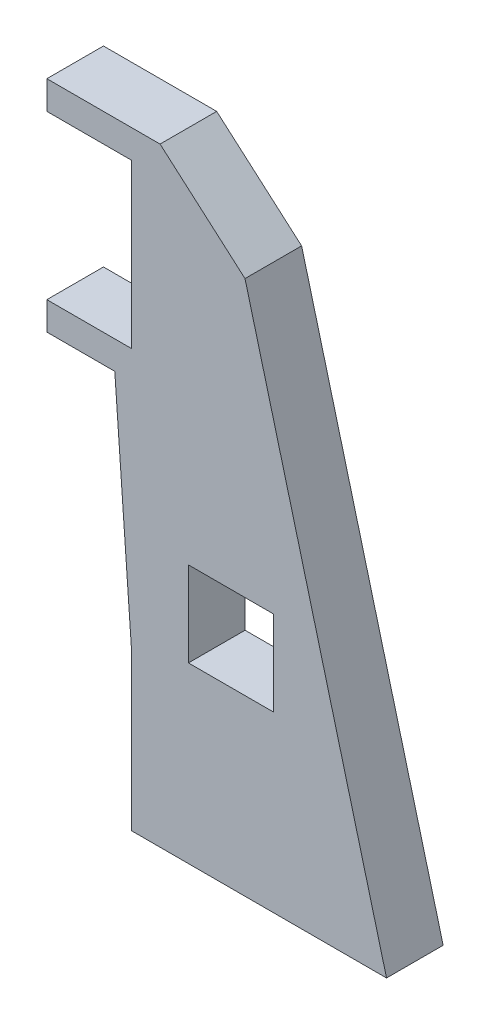
ISO-10303-21;
HEADER;
FILE_DESCRIPTION(('STEP AP214'),'2;1');
FILE_NAME('part.step','',(''),(''),'','','');
FILE_SCHEMA(('AUTOMOTIVE_DESIGN { 1 0 10303 214 1 1 1 1 }'));
ENDSEC;
DATA;
#1=APPLICATION_CONTEXT('core data for automotive mechanical design processes');
#2=APPLICATION_PROTOCOL_DEFINITION('international standard','automotive_design',2000,#1);
#3=PRODUCT_CONTEXT('',#1,'mechanical');
#4=PRODUCT('Part','Part','',(#3));
#5=PRODUCT_RELATED_PRODUCT_CATEGORY('part','',(#4));
#6=PRODUCT_DEFINITION_FORMATION('','',#4);
#7=PRODUCT_DEFINITION_CONTEXT('part definition',#1,'design');
#8=PRODUCT_DEFINITION('design','',#6,#7);
#9=PRODUCT_DEFINITION_SHAPE('','',#8);
#10=(LENGTH_UNIT() NAMED_UNIT(*) SI_UNIT(.MILLI.,.METRE.));
#11=(NAMED_UNIT(*) PLANE_ANGLE_UNIT() SI_UNIT($,.RADIAN.));
#12=(NAMED_UNIT(*) SI_UNIT($,.STERADIAN.) SOLID_ANGLE_UNIT());
#13=UNCERTAINTY_MEASURE_WITH_UNIT(LENGTH_MEASURE(1.E-05),#10,'distance_accuracy_value','');
#14=(GEOMETRIC_REPRESENTATION_CONTEXT(3) GLOBAL_UNCERTAINTY_ASSIGNED_CONTEXT((#13)) GLOBAL_UNIT_ASSIGNED_CONTEXT((#10,
#11,#12)) REPRESENTATION_CONTEXT('',''));
#15=CARTESIAN_POINT('',(0.,0.,0.));
#16=DIRECTION('',(0.,0.,1.));
#17=DIRECTION('',(1.,0.,0.));
#18=AXIS2_PLACEMENT_3D('',#15,#16,#17);
#19=CARTESIAN_POINT('',(0.,0.,25.4));
#20=DIRECTION('',(0.,1.,0.));
#21=DIRECTION('',(0.,0.,1.));
#22=AXIS2_PLACEMENT_3D('',#19,#20,#21);
#23=PLANE('',#22);
#24=DIRECTION('',(1.,0.,0.));
#25=VECTOR('',#24,1.);
#26=CARTESIAN_POINT('',(0.,0.,0.));
#27=LINE('',#26,#25);
#28=CARTESIAN_POINT('',(0.,0.,0.));
#29=VERTEX_POINT('',#28);
#30=CARTESIAN_POINT('',(38.0186594192209,0.,0.));
#31=VERTEX_POINT('',#30);
#32=EDGE_CURVE('E194',#29,#31,#27,.T.);
#33=ORIENTED_EDGE('',*,*,#32,.T.);
#34=DIRECTION('',(0.,0.,-1.));
#35=VECTOR('',#34,1.);
#36=CARTESIAN_POINT('',(38.0186594192209,0.,25.4));
#37=LINE('',#36,#35);
#38=CARTESIAN_POINT('',(38.0186594192209,0.,25.4));
#39=VERTEX_POINT('',#38);
#40=EDGE_CURVE('E11',#39,#31,#37,.T.);
#41=ORIENTED_EDGE('',*,*,#40,.F.);
#42=DIRECTION('',(1.,0.,0.));
#43=VECTOR('',#42,1.);
#44=CARTESIAN_POINT('',(0.,0.,25.4));
#45=LINE('',#44,#43);
#46=CARTESIAN_POINT('',(0.,0.,25.4));
#47=VERTEX_POINT('',#46);
#48=EDGE_CURVE('E200',#47,#39,#45,.T.);
#49=ORIENTED_EDGE('',*,*,#48,.F.);
#50=DIRECTION('',(0.,0.,-1.));
#51=VECTOR('',#50,1.);
#52=CARTESIAN_POINT('',(0.,0.,25.4));
#53=LINE('',#52,#51);
#54=EDGE_CURVE('E238',#47,#29,#53,.T.);
#55=ORIENTED_EDGE('',*,*,#54,.T.);
#56=EDGE_LOOP('',(#33,#41,#49,#55));
#57=FACE_BOUND('',#56,.T.);
#58=ADVANCED_FACE('F38',(#57),#23,.F.);
#59=CARTESIAN_POINT('',(38.0186594192209,0.,25.4));
#60=DIRECTION('',(1.,0.,0.));
#61=DIRECTION('',(0.,0.,-1.));
#62=AXIS2_PLACEMENT_3D('',#59,#60,#61);
#63=PLANE('',#62);
#64=DIRECTION('',(0.,-1.,0.));
#65=VECTOR('',#64,1.);
#66=CARTESIAN_POINT('',(38.0186594192209,0.,0.));
#67=LINE('',#66,#65);
#68=CARTESIAN_POINT('',(38.0186594192209,-73.1522603664943,0.));
#69=VERTEX_POINT('',#68);
#70=EDGE_CURVE('E242',#31,#69,#67,.T.);
#71=ORIENTED_EDGE('',*,*,#70,.T.);
#72=DIRECTION('',(0.,0.,-1.));
#73=VECTOR('',#72,1.);
#74=CARTESIAN_POINT('',(38.0186594192209,-73.1522603664943,25.4));
#75=LINE('',#74,#73);
#76=CARTESIAN_POINT('',(38.0186594192209,-73.1522603664943,25.4));
#77=VERTEX_POINT('',#76);
#78=EDGE_CURVE('E46',#77,#69,#75,.T.);
#79=ORIENTED_EDGE('',*,*,#78,.F.);
#80=DIRECTION('',(0.,-1.,0.));
#81=VECTOR('',#80,1.);
#82=CARTESIAN_POINT('',(38.0186594192209,0.,25.4));
#83=LINE('',#82,#81);
#84=EDGE_CURVE('E204',#39,#77,#83,.T.);
#85=ORIENTED_EDGE('',*,*,#84,.F.);
#86=ORIENTED_EDGE('',*,*,#40,.T.);
#87=EDGE_LOOP('',(#71,#79,#85,#86));
#88=FACE_BOUND('',#87,.T.);
#89=ADVANCED_FACE('F339',(#88),#63,.F.);
#90=CARTESIAN_POINT('',(38.0186594192209,-73.1522603664943,25.4));
#91=DIRECTION('',(0.,-1.,0.));
#92=DIRECTION('',(0.,0.,-1.));
#93=AXIS2_PLACEMENT_3D('',#90,#91,#92);
#94=PLANE('',#93);
#95=DIRECTION('',(-1.,0.,0.));
#96=VECTOR('',#95,1.);
#97=CARTESIAN_POINT('',(38.0186594192209,-73.1522603664943,0.));
#98=LINE('',#97,#96);
#99=CARTESIAN_POINT('',(0.,-73.1522603664943,0.));
#100=VERTEX_POINT('',#99);
#101=EDGE_CURVE('E245',#69,#100,#98,.T.);
#102=ORIENTED_EDGE('',*,*,#101,.T.);
#103=DIRECTION('',(0.,0.,-1.));
#104=VECTOR('',#103,1.);
#105=CARTESIAN_POINT('',(0.,-73.1522603664943,25.4));
#106=LINE('',#105,#104);
#107=CARTESIAN_POINT('',(0.,-73.1522603664943,25.4));
#108=VERTEX_POINT('',#107);
#109=EDGE_CURVE('E309',#108,#100,#106,.T.);
#110=ORIENTED_EDGE('',*,*,#109,.F.);
#111=DIRECTION('',(-1.,0.,0.));
#112=VECTOR('',#111,1.);
#113=CARTESIAN_POINT('',(38.0186594192209,-73.1522603664943,25.4));
#114=LINE('',#113,#112);
#115=EDGE_CURVE('E208',#77,#108,#114,.T.);
#116=ORIENTED_EDGE('',*,*,#115,.F.);
#117=ORIENTED_EDGE('',*,*,#78,.T.);
#118=EDGE_LOOP('',(#102,#110,#116,#117));
#119=FACE_BOUND('',#118,.T.);
#120=ADVANCED_FACE('F318',(#119),#94,.F.);
#121=CARTESIAN_POINT('',(0.,-73.1522603664943,25.4));
#122=DIRECTION('',(1.,0.,0.));
#123=DIRECTION('',(0.,0.,-1.));
#124=AXIS2_PLACEMENT_3D('',#121,#122,#123);
#125=PLANE('',#124);
#126=DIRECTION('',(0.,-1.,0.));
#127=VECTOR('',#126,1.);
#128=CARTESIAN_POINT('',(0.,-73.1522603664943,0.));
#129=LINE('',#128,#127);
#130=CARTESIAN_POINT('',(0.,-85.7639267927339,0.));
#131=VERTEX_POINT('',#130);
#132=EDGE_CURVE('E248',#100,#131,#129,.T.);
#133=ORIENTED_EDGE('',*,*,#132,.T.);
#134=DIRECTION('',(0.,0.,-1.));
#135=VECTOR('',#134,1.);
#136=CARTESIAN_POINT('',(0.,-85.7639267927339,25.4));
#137=LINE('',#136,#135);
#138=CARTESIAN_POINT('',(0.,-85.7639267927339,25.4));
#139=VERTEX_POINT('',#138);
#140=EDGE_CURVE('E305',#139,#131,#137,.T.);
#141=ORIENTED_EDGE('',*,*,#140,.F.);
#142=DIRECTION('',(0.,-1.,0.));
#143=VECTOR('',#142,1.);
#144=CARTESIAN_POINT('',(0.,-73.1522603664943,25.4));
#145=LINE('',#144,#143);
#146=EDGE_CURVE('E211',#108,#139,#145,.T.);
#147=ORIENTED_EDGE('',*,*,#146,.F.);
#148=ORIENTED_EDGE('',*,*,#109,.T.);
#149=EDGE_LOOP('',(#133,#141,#147,#148));
#150=FACE_BOUND('',#149,.T.);
#151=ADVANCED_FACE('F329',(#150),#125,.F.);
#152=CARTESIAN_POINT('',(0.,-85.7639267927339,25.4));
#153=DIRECTION('',(0.,1.,0.));
#154=DIRECTION('',(0.,0.,1.));
#155=AXIS2_PLACEMENT_3D('',#152,#153,#154);
#156=PLANE('',#155);
#157=DIRECTION('',(1.,0.,0.));
#158=VECTOR('',#157,1.);
#159=CARTESIAN_POINT('',(0.,-85.7639267927339,0.));
#160=LINE('',#159,#158);
#161=CARTESIAN_POINT('',(30.48,-85.7639267927339,0.));
#162=VERTEX_POINT('',#161);
#163=EDGE_CURVE('E251',#131,#162,#160,.T.);
#164=ORIENTED_EDGE('',*,*,#163,.T.);
#165=DIRECTION('',(0.,0.,-1.));
#166=VECTOR('',#165,1.);
#167=CARTESIAN_POINT('',(30.48,-85.7639267927339,25.4));
#168=LINE('',#167,#166);
#169=CARTESIAN_POINT('',(30.48,-85.7639267927339,25.4));
#170=VERTEX_POINT('',#169);
#171=EDGE_CURVE('E301',#170,#162,#168,.T.);
#172=ORIENTED_EDGE('',*,*,#171,.F.);
#173=DIRECTION('',(1.,0.,0.));
#174=VECTOR('',#173,1.);
#175=CARTESIAN_POINT('',(0.,-85.7639267927339,25.4));
#176=LINE('',#175,#174);
#177=EDGE_CURVE('E214',#139,#170,#176,.T.);
#178=ORIENTED_EDGE('',*,*,#177,.F.);
#179=ORIENTED_EDGE('',*,*,#140,.T.);
#180=EDGE_LOOP('',(#164,#172,#178,#179));
#181=FACE_BOUND('',#180,.T.);
#182=ADVANCED_FACE('F333',(#181),#156,.F.);
#183=CARTESIAN_POINT('',(30.48,-85.7639267927339,25.4));
#184=DIRECTION('',(0.997429246927339,0.071658198232729,0.));
#185=DIRECTION('',(-0.071658198232729,0.997429246927339,0.));
#186=AXIS2_PLACEMENT_3D('',#183,#184,#185);
#187=PLANE('',#186);
#188=DIRECTION('',(0.071658198232729,-0.997429246927339,0.));
#189=VECTOR('',#188,1.);
#190=CARTESIAN_POINT('',(30.48,-85.7639267927339,0.));
#191=LINE('',#190,#189);
#192=CARTESIAN_POINT('',(38.0186594192209,-190.696503564123,0.));
#193=VERTEX_POINT('',#192);
#194=EDGE_CURVE('E254',#162,#193,#191,.T.);
#195=ORIENTED_EDGE('',*,*,#194,.T.);
#196=DIRECTION('',(0.,0.,-1.));
#197=VECTOR('',#196,1.);
#198=CARTESIAN_POINT('',(38.0186594192209,-190.696503564123,25.4));
#199=LINE('',#198,#197);
#200=CARTESIAN_POINT('',(38.0186594192209,-190.696503564123,25.4));
#201=VERTEX_POINT('',#200);
#202=EDGE_CURVE('E297',#201,#193,#199,.T.);
#203=ORIENTED_EDGE('',*,*,#202,.F.);
#204=DIRECTION('',(0.071658198232729,-0.997429246927339,0.));
#205=VECTOR('',#204,1.);
#206=CARTESIAN_POINT('',(30.48,-85.7639267927339,25.4));
#207=LINE('',#206,#205);
#208=EDGE_CURVE('E217',#170,#201,#207,.T.);
#209=ORIENTED_EDGE('',*,*,#208,.F.);
#210=ORIENTED_EDGE('',*,*,#171,.T.);
#211=EDGE_LOOP('',(#195,#203,#209,#210));
#212=FACE_BOUND('',#211,.T.);
#213=ADVANCED_FACE('F372',(#212),#187,.F.);
#214=CARTESIAN_POINT('',(38.0186594192209,-190.696503564123,25.4));
#215=DIRECTION('',(1.,0.,0.));
#216=DIRECTION('',(0.,0.,-1.));
#217=AXIS2_PLACEMENT_3D('',#214,#215,#216);
#218=PLANE('',#217);
#219=DIRECTION('',(0.,-1.,0.));
#220=VECTOR('',#219,1.);
#221=CARTESIAN_POINT('',(38.0186594192209,-190.696503564123,0.));
#222=LINE('',#221,#220);
#223=CARTESIAN_POINT('',(38.0186594192209,-260.515926792734,0.));
#224=VERTEX_POINT('',#223);
#225=EDGE_CURVE('E257',#193,#224,#222,.T.);
#226=ORIENTED_EDGE('',*,*,#225,.T.);
#227=DIRECTION('',(0.,0.,-1.));
#228=VECTOR('',#227,1.);
#229=CARTESIAN_POINT('',(38.0186594192209,-260.515926792734,25.4));
#230=LINE('',#229,#228);
#231=CARTESIAN_POINT('',(38.0186594192209,-260.515926792734,25.4));
#232=VERTEX_POINT('',#231);
#233=EDGE_CURVE('E293',#232,#224,#230,.T.);
#234=ORIENTED_EDGE('',*,*,#233,.F.);
#235=DIRECTION('',(0.,-1.,0.));
#236=VECTOR('',#235,1.);
#237=CARTESIAN_POINT('',(38.0186594192209,-190.696503564123,25.4));
#238=LINE('',#237,#236);
#239=EDGE_CURVE('E220',#201,#232,#238,.T.);
#240=ORIENTED_EDGE('',*,*,#239,.F.);
#241=ORIENTED_EDGE('',*,*,#202,.T.);
#242=EDGE_LOOP('',(#226,#234,#240,#241));
#243=FACE_BOUND('',#242,.T.);
#244=ADVANCED_FACE('F370',(#243),#218,.F.);
#245=CARTESIAN_POINT('',(38.0186594192209,-260.515926792734,25.4));
#246=DIRECTION('',(0.,1.,0.));
#247=DIRECTION('',(-1.,0.,0.));
#248=AXIS2_PLACEMENT_3D('',#245,#246,#247);
#249=PLANE('',#248);
#250=DIRECTION('',(1.,0.,0.));
#251=VECTOR('',#250,1.);
#252=CARTESIAN_POINT('',(38.0186594192209,-260.515926792734,0.));
#253=LINE('',#252,#251);
#254=CARTESIAN_POINT('',(152.4,-260.515926792734,0.));
#255=VERTEX_POINT('',#254);
#256=EDGE_CURVE('E260',#224,#255,#253,.T.);
#257=ORIENTED_EDGE('',*,*,#256,.T.);
#258=DIRECTION('',(0.,0.,-1.));
#259=VECTOR('',#258,1.);
#260=CARTESIAN_POINT('',(152.4,-260.515926792734,25.4));
#261=LINE('',#260,#259);
#262=CARTESIAN_POINT('',(152.4,-260.515926792734,25.4));
#263=VERTEX_POINT('',#262);
#264=EDGE_CURVE('E289',#263,#255,#261,.T.);
#265=ORIENTED_EDGE('',*,*,#264,.F.);
#266=DIRECTION('',(1.,0.,0.));
#267=VECTOR('',#266,1.);
#268=CARTESIAN_POINT('',(38.0186594192209,-260.515926792734,25.4));
#269=LINE('',#268,#267);
#270=EDGE_CURVE('E223',#232,#263,#269,.T.);
#271=ORIENTED_EDGE('',*,*,#270,.F.);
#272=ORIENTED_EDGE('',*,*,#233,.T.);
#273=EDGE_LOOP('',(#257,#265,#271,#272));
#274=FACE_BOUND('',#273,.T.);
#275=ADVANCED_FACE('F366',(#274),#249,.F.);
#276=CARTESIAN_POINT('',(152.4,-260.515926792734,25.4));
#277=DIRECTION('',(-0.966736029953068,-0.255776168535266,0.));
#278=DIRECTION('',(0.255776168535266,-0.966736029953068,0.));
#279=AXIS2_PLACEMENT_3D('',#276,#277,#278);
#280=PLANE('',#279);
#281=DIRECTION('',(-0.255776168535266,0.966736029953068,0.));
#282=VECTOR('',#281,1.);
#283=CARTESIAN_POINT('',(152.4,-260.515926792734,0.));
#284=LINE('',#283,#282);
#285=CARTESIAN_POINT('',(88.9,-20.5102286326416,0.));
#286=VERTEX_POINT('',#285);
#287=EDGE_CURVE('E263',#255,#286,#284,.T.);
#288=ORIENTED_EDGE('',*,*,#287,.T.);
#289=DIRECTION('',(0.,0.,-1.));
#290=VECTOR('',#289,1.);
#291=CARTESIAN_POINT('',(88.9,-20.5102286326416,25.4));
#292=LINE('',#291,#290);
#293=CARTESIAN_POINT('',(88.9,-20.5102286326416,25.4));
#294=VERTEX_POINT('',#293);
#295=EDGE_CURVE('E285',#294,#286,#292,.T.);
#296=ORIENTED_EDGE('',*,*,#295,.F.);
#297=DIRECTION('',(-0.255776168535266,0.966736029953068,0.));
#298=VECTOR('',#297,1.);
#299=CARTESIAN_POINT('',(152.4,-260.515926792734,25.4));
#300=LINE('',#299,#298);
#301=EDGE_CURVE('E226',#263,#294,#300,.T.);
#302=ORIENTED_EDGE('',*,*,#301,.F.);
#303=ORIENTED_EDGE('',*,*,#264,.T.);
#304=EDGE_LOOP('',(#288,#296,#302,#303));
#305=FACE_BOUND('',#304,.T.);
#306=ADVANCED_FACE('F361',(#305),#280,.F.);
#307=CARTESIAN_POINT('',(50.8,12.7,25.4));
#308=DIRECTION('',(-0.657077237358178,-0.753823257896534,0.));
#309=DIRECTION('',(0.753823257896534,-0.657077237358178,0.));
#310=AXIS2_PLACEMENT_3D('',#307,#308,#309);
#311=PLANE('',#310);
#312=DIRECTION('',(-0.753823257896534,0.657077237358178,0.));
#313=VECTOR('',#312,1.);
#314=CARTESIAN_POINT('',(50.8,12.7,0.));
#315=LINE('',#314,#313);
#316=CARTESIAN_POINT('',(50.8,12.7,0.));
#317=VERTEX_POINT('',#316);
#318=EDGE_CURVE('E266',#286,#317,#315,.T.);
#319=ORIENTED_EDGE('',*,*,#318,.T.);
#320=DIRECTION('',(0.,0.,-1.));
#321=VECTOR('',#320,1.);
#322=CARTESIAN_POINT('',(50.8,12.7,25.4));
#323=LINE('',#322,#321);
#324=CARTESIAN_POINT('',(50.8,12.7,25.4));
#325=VERTEX_POINT('',#324);
#326=EDGE_CURVE('E281',#325,#317,#323,.T.);
#327=ORIENTED_EDGE('',*,*,#326,.F.);
#328=DIRECTION('',(-0.753823257896534,0.657077237358178,0.));
#329=VECTOR('',#328,1.);
#330=CARTESIAN_POINT('',(50.8,12.7,25.4));
#331=LINE('',#330,#329);
#332=EDGE_CURVE('E229',#294,#325,#331,.T.);
#333=ORIENTED_EDGE('',*,*,#332,.F.);
#334=ORIENTED_EDGE('',*,*,#295,.T.);
#335=EDGE_LOOP('',(#319,#327,#333,#334));
#336=FACE_BOUND('',#335,.T.);
#337=ADVANCED_FACE('F355',(#336),#311,.F.);
#338=CARTESIAN_POINT('',(0.,12.7,25.4));
#339=DIRECTION('',(0.,-1.,0.));
#340=DIRECTION('',(0.,0.,-1.));
#341=AXIS2_PLACEMENT_3D('',#338,#339,#340);
#342=PLANE('',#341);
#343=DIRECTION('',(-1.,0.,0.));
#344=VECTOR('',#343,1.);
#345=CARTESIAN_POINT('',(0.,12.7,0.));
#346=LINE('',#345,#344);
#347=CARTESIAN_POINT('',(0.,12.7,0.));
#348=VERTEX_POINT('',#347);
#349=EDGE_CURVE('E269',#317,#348,#346,.T.);
#350=ORIENTED_EDGE('',*,*,#349,.T.);
#351=DIRECTION('',(0.,0.,-1.));
#352=VECTOR('',#351,1.);
#353=CARTESIAN_POINT('',(0.,12.7,25.4));
#354=LINE('',#353,#352);
#355=CARTESIAN_POINT('',(0.,12.7,25.4));
#356=VERTEX_POINT('',#355);
#357=EDGE_CURVE('E277',#356,#348,#354,.T.);
#358=ORIENTED_EDGE('',*,*,#357,.F.);
#359=DIRECTION('',(-1.,0.,0.));
#360=VECTOR('',#359,1.);
#361=CARTESIAN_POINT('',(0.,12.7,25.4));
#362=LINE('',#361,#360);
#363=EDGE_CURVE('E232',#325,#356,#362,.T.);
#364=ORIENTED_EDGE('',*,*,#363,.F.);
#365=ORIENTED_EDGE('',*,*,#326,.T.);
#366=EDGE_LOOP('',(#350,#358,#364,#365));
#367=FACE_BOUND('',#366,.T.);
#368=ADVANCED_FACE('F351',(#367),#342,.F.);
#369=CARTESIAN_POINT('',(0.,0.,25.4));
#370=DIRECTION('',(1.,0.,0.));
#371=DIRECTION('',(0.,0.,-1.));
#372=AXIS2_PLACEMENT_3D('',#369,#370,#371);
#373=PLANE('',#372);
#374=DIRECTION('',(0.,-1.,0.));
#375=VECTOR('',#374,1.);
#376=CARTESIAN_POINT('',(0.,0.,0.));
#377=LINE('',#376,#375);
#378=EDGE_CURVE('E205',#348,#29,#377,.T.);
#379=ORIENTED_EDGE('',*,*,#378,.T.);
#380=ORIENTED_EDGE('',*,*,#54,.F.);
#381=DIRECTION('',(0.,-1.,0.));
#382=VECTOR('',#381,1.);
#383=CARTESIAN_POINT('',(0.,0.,25.4));
#384=LINE('',#383,#382);
#385=EDGE_CURVE('E235',#356,#47,#384,.T.);
#386=ORIENTED_EDGE('',*,*,#385,.F.);
#387=ORIENTED_EDGE('',*,*,#357,.T.);
#388=EDGE_LOOP('',(#379,#380,#386,#387));
#389=FACE_BOUND('',#388,.T.);
#390=ADVANCED_FACE('F346',(#389),#373,.F.);
#391=CARTESIAN_POINT('',(0.,0.,25.4));
#392=DIRECTION('',(0.,0.,-1.));
#393=DIRECTION('',(-1.,0.,0.));
#394=AXIS2_PLACEMENT_3D('',#391,#392,#393);
#395=PLANE('',#394);
#396=DIRECTION('',(-1.,0.,0.));
#397=VECTOR('',#396,1.);
#398=CARTESIAN_POINT('',(63.5245647039966,-182.537926792734,25.4));
#399=LINE('',#398,#397);
#400=CARTESIAN_POINT('',(101.624564703997,-182.537926792734,25.4));
#401=VERTEX_POINT('',#400);
#402=CARTESIAN_POINT('',(63.5245647039966,-182.537926792734,25.4));
#403=VERTEX_POINT('',#402);
#404=EDGE_CURVE('E160',#401,#403,#399,.T.);
#405=ORIENTED_EDGE('',*,*,#404,.T.);
#406=DIRECTION('',(0.,1.,0.));
#407=VECTOR('',#406,1.);
#408=CARTESIAN_POINT('',(63.5245647039966,-182.537926792734,25.4));
#409=LINE('',#408,#407);
#410=CARTESIAN_POINT('',(63.5245647039966,-144.437926792734,25.4));
#411=VERTEX_POINT('',#410);
#412=EDGE_CURVE('E153',#403,#411,#409,.T.);
#413=ORIENTED_EDGE('',*,*,#412,.T.);
#414=DIRECTION('',(1.,0.,0.));
#415=VECTOR('',#414,1.);
#416=CARTESIAN_POINT('',(63.5245647039966,-144.437926792734,25.4));
#417=LINE('',#416,#415);
#418=CARTESIAN_POINT('',(101.624564703997,-144.437926792734,25.4));
#419=VERTEX_POINT('',#418);
#420=EDGE_CURVE('E163',#411,#419,#417,.T.);
#421=ORIENTED_EDGE('',*,*,#420,.T.);
#422=DIRECTION('',(0.,-1.,0.));
#423=VECTOR('',#422,1.);
#424=CARTESIAN_POINT('',(101.624564703997,-182.537926792734,25.4));
#425=LINE('',#424,#423);
#426=EDGE_CURVE('E53',#419,#401,#425,.T.);
#427=ORIENTED_EDGE('',*,*,#426,.T.);
#428=EDGE_LOOP('',(#405,#413,#421,#427));
#429=FACE_BOUND('',#428,.T.);
#430=ORIENTED_EDGE('',*,*,#48,.T.);
#431=ORIENTED_EDGE('',*,*,#84,.T.);
#432=ORIENTED_EDGE('',*,*,#115,.T.);
#433=ORIENTED_EDGE('',*,*,#146,.T.);
#434=ORIENTED_EDGE('',*,*,#177,.T.);
#435=ORIENTED_EDGE('',*,*,#208,.T.);
#436=ORIENTED_EDGE('',*,*,#239,.T.);
#437=ORIENTED_EDGE('',*,*,#270,.T.);
#438=ORIENTED_EDGE('',*,*,#301,.T.);
#439=ORIENTED_EDGE('',*,*,#332,.T.);
#440=ORIENTED_EDGE('',*,*,#363,.T.);
#441=ORIENTED_EDGE('',*,*,#385,.T.);
#442=EDGE_LOOP('',(#430,#431,#432,#433,#434,#435,#436,#437,#438,#439,#440,#441));
#443=FACE_BOUND('',#442,.T.);
#444=ADVANCED_FACE('F168',(#429,#443),#395,.F.);
#445=CARTESIAN_POINT('',(0.,0.,0.));
#446=DIRECTION('',(0.,0.,-1.));
#447=DIRECTION('',(-1.,0.,0.));
#448=AXIS2_PLACEMENT_3D('',#445,#446,#447);
#449=PLANE('',#448);
#450=DIRECTION('',(0.,1.,0.));
#451=VECTOR('',#450,1.);
#452=CARTESIAN_POINT('',(63.5245647039966,-182.537926792734,0.));
#453=LINE('',#452,#451);
#454=CARTESIAN_POINT('',(63.5245647039966,-182.537926792734,0.));
#455=VERTEX_POINT('',#454);
#456=CARTESIAN_POINT('',(63.5245647039966,-144.437926792734,0.));
#457=VERTEX_POINT('',#456);
#458=EDGE_CURVE('E61',#455,#457,#453,.T.);
#459=ORIENTED_EDGE('',*,*,#458,.F.);
#460=DIRECTION('',(-1.,0.,0.));
#461=VECTOR('',#460,1.);
#462=CARTESIAN_POINT('',(63.5245647039966,-182.537926792734,0.));
#463=LINE('',#462,#461);
#464=CARTESIAN_POINT('',(101.624564703997,-182.537926792734,0.));
#465=VERTEX_POINT('',#464);
#466=EDGE_CURVE('E172',#465,#455,#463,.T.);
#467=ORIENTED_EDGE('',*,*,#466,.F.);
#468=DIRECTION('',(0.,-1.,0.));
#469=VECTOR('',#468,1.);
#470=CARTESIAN_POINT('',(101.624564703997,-182.537926792734,0.));
#471=LINE('',#470,#469);
#472=CARTESIAN_POINT('',(101.624564703997,-144.437926792734,0.));
#473=VERTEX_POINT('',#472);
#474=EDGE_CURVE('E176',#473,#465,#471,.T.);
#475=ORIENTED_EDGE('',*,*,#474,.F.);
#476=DIRECTION('',(1.,0.,0.));
#477=VECTOR('',#476,1.);
#478=CARTESIAN_POINT('',(63.5245647039966,-144.437926792734,0.));
#479=LINE('',#478,#477);
#480=EDGE_CURVE('E185',#457,#473,#479,.T.);
#481=ORIENTED_EDGE('',*,*,#480,.F.);
#482=EDGE_LOOP('',(#459,#467,#475,#481));
#483=FACE_BOUND('',#482,.T.);
#484=ORIENTED_EDGE('',*,*,#32,.F.);
#485=ORIENTED_EDGE('',*,*,#378,.F.);
#486=ORIENTED_EDGE('',*,*,#349,.F.);
#487=ORIENTED_EDGE('',*,*,#318,.F.);
#488=ORIENTED_EDGE('',*,*,#287,.F.);
#489=ORIENTED_EDGE('',*,*,#256,.F.);
#490=ORIENTED_EDGE('',*,*,#225,.F.);
#491=ORIENTED_EDGE('',*,*,#194,.F.);
#492=ORIENTED_EDGE('',*,*,#163,.F.);
#493=ORIENTED_EDGE('',*,*,#132,.F.);
#494=ORIENTED_EDGE('',*,*,#101,.F.);
#495=ORIENTED_EDGE('',*,*,#70,.F.);
#496=EDGE_LOOP('',(#484,#485,#486,#487,#488,#489,#490,#491,#492,#493,#494,#495));
#497=FACE_BOUND('',#496,.T.);
#498=ADVANCED_FACE('F324',(#483,#497),#449,.T.);
#499=CARTESIAN_POINT('',(63.5245647039966,-182.537926792734,25.4));
#500=DIRECTION('',(-1.,0.,0.));
#501=DIRECTION('',(0.,0.,1.));
#502=AXIS2_PLACEMENT_3D('',#499,#500,#501);
#503=PLANE('',#502);
#504=ORIENTED_EDGE('',*,*,#458,.T.);
#505=DIRECTION('',(0.,0.,-1.));
#506=VECTOR('',#505,1.);
#507=CARTESIAN_POINT('',(63.5245647039966,-144.437926792734,25.4));
#508=LINE('',#507,#506);
#509=EDGE_CURVE('E149',#411,#457,#508,.T.);
#510=ORIENTED_EDGE('',*,*,#509,.F.);
#511=ORIENTED_EDGE('',*,*,#412,.F.);
#512=DIRECTION('',(0.,0.,-1.));
#513=VECTOR('',#512,1.);
#514=CARTESIAN_POINT('',(63.5245647039966,-182.537926792734,25.4));
#515=LINE('',#514,#513);
#516=EDGE_CURVE('E191',#403,#455,#515,.T.);
#517=ORIENTED_EDGE('',*,*,#516,.T.);
#518=EDGE_LOOP('',(#504,#510,#511,#517));
#519=FACE_BOUND('',#518,.T.);
#520=ADVANCED_FACE('F151',(#519),#503,.F.);
#521=CARTESIAN_POINT('',(63.5245647039966,-182.537926792734,25.4));
#522=DIRECTION('',(0.,-1.,0.));
#523=DIRECTION('',(1.,0.,0.));
#524=AXIS2_PLACEMENT_3D('',#521,#522,#523);
#525=PLANE('',#524);
#526=ORIENTED_EDGE('',*,*,#466,.T.);
#527=ORIENTED_EDGE('',*,*,#516,.F.);
#528=ORIENTED_EDGE('',*,*,#404,.F.);
#529=DIRECTION('',(0.,0.,-1.));
#530=VECTOR('',#529,1.);
#531=CARTESIAN_POINT('',(101.624564703997,-182.537926792734,25.4));
#532=LINE('',#531,#530);
#533=EDGE_CURVE('E195',#401,#465,#532,.T.);
#534=ORIENTED_EDGE('',*,*,#533,.T.);
#535=EDGE_LOOP('',(#526,#527,#528,#534));
#536=FACE_BOUND('',#535,.T.);
#537=ADVANCED_FACE('F471',(#536),#525,.F.);
#538=CARTESIAN_POINT('',(101.624564703997,-182.537926792734,25.4));
#539=DIRECTION('',(1.,0.,0.));
#540=DIRECTION('',(0.,0.,-1.));
#541=AXIS2_PLACEMENT_3D('',#538,#539,#540);
#542=PLANE('',#541);
#543=ORIENTED_EDGE('',*,*,#474,.T.);
#544=ORIENTED_EDGE('',*,*,#533,.F.);
#545=ORIENTED_EDGE('',*,*,#426,.F.);
#546=DIRECTION('',(0.,0.,-1.));
#547=VECTOR('',#546,1.);
#548=CARTESIAN_POINT('',(101.624564703997,-144.437926792734,25.4));
#549=LINE('',#548,#547);
#550=EDGE_CURVE('E159',#419,#473,#549,.T.);
#551=ORIENTED_EDGE('',*,*,#550,.T.);
#552=EDGE_LOOP('',(#543,#544,#545,#551));
#553=FACE_BOUND('',#552,.T.);
#554=ADVANCED_FACE('F480',(#553),#542,.F.);
#555=CARTESIAN_POINT('',(63.5245647039966,-144.437926792734,25.4));
#556=DIRECTION('',(0.,1.,0.));
#557=DIRECTION('',(0.,0.,1.));
#558=AXIS2_PLACEMENT_3D('',#555,#556,#557);
#559=PLANE('',#558);
#560=ORIENTED_EDGE('',*,*,#480,.T.);
#561=ORIENTED_EDGE('',*,*,#550,.F.);
#562=ORIENTED_EDGE('',*,*,#420,.F.);
#563=ORIENTED_EDGE('',*,*,#509,.T.);
#564=EDGE_LOOP('',(#560,#561,#562,#563));
#565=FACE_BOUND('',#564,.T.);
#566=ADVANCED_FACE('F164',(#565),#559,.F.);
#567=CLOSED_SHELL('',(#58,#89,#120,#151,#182,#213,#244,#275,#306,#337,#368,#390,#444,#498,#520,
#537,#554,#566));
#568=MANIFOLD_SOLID_BREP('B2',#567);
#569=ADVANCED_BREP_SHAPE_REPRESENTATION('',(#18,#568),#14);
#570=SHAPE_DEFINITION_REPRESENTATION(#9,#569);
ENDSEC;
END-ISO-10303-21;
